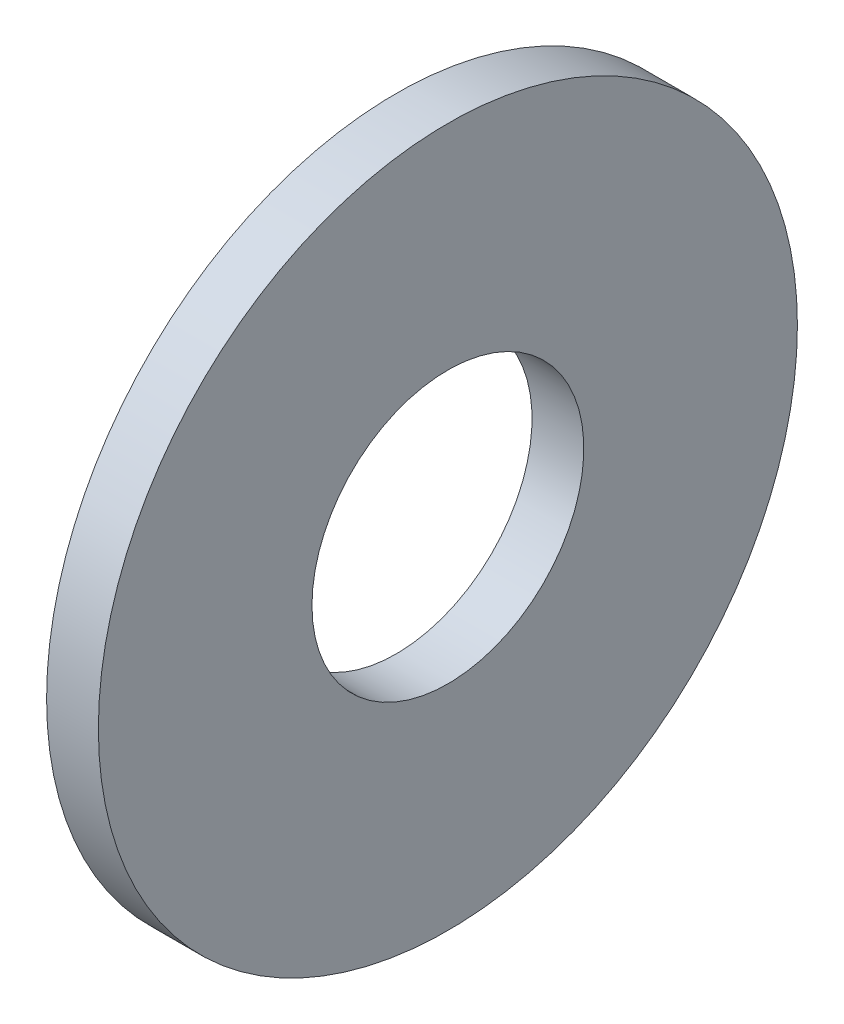
ISO-10303-21;
HEADER;
FILE_DESCRIPTION(('STEP AP214'),'2;1');
FILE_NAME('part.step','',(''),(''),'','','');
FILE_SCHEMA(('AUTOMOTIVE_DESIGN { 1 0 10303 214 1 1 1 1 }'));
ENDSEC;
DATA;
#1=APPLICATION_CONTEXT('core data for automotive mechanical design processes');
#2=APPLICATION_PROTOCOL_DEFINITION('international standard','automotive_design',2000,#1);
#3=PRODUCT_CONTEXT('',#1,'mechanical');
#4=PRODUCT('Part','Part','',(#3));
#5=PRODUCT_RELATED_PRODUCT_CATEGORY('part','',(#4));
#6=PRODUCT_DEFINITION_FORMATION('','',#4);
#7=PRODUCT_DEFINITION_CONTEXT('part definition',#1,'design');
#8=PRODUCT_DEFINITION('design','',#6,#7);
#9=PRODUCT_DEFINITION_SHAPE('','',#8);
#10=(LENGTH_UNIT() NAMED_UNIT(*) SI_UNIT(.MILLI.,.METRE.));
#11=(NAMED_UNIT(*) PLANE_ANGLE_UNIT() SI_UNIT($,.RADIAN.));
#12=(NAMED_UNIT(*) SI_UNIT($,.STERADIAN.) SOLID_ANGLE_UNIT());
#13=UNCERTAINTY_MEASURE_WITH_UNIT(LENGTH_MEASURE(1.E-05),#10,'distance_accuracy_value','');
#14=(GEOMETRIC_REPRESENTATION_CONTEXT(3) GLOBAL_UNCERTAINTY_ASSIGNED_CONTEXT((#13)) GLOBAL_UNIT_ASSIGNED_CONTEXT((#10,
#11,#12)) REPRESENTATION_CONTEXT('',''));
#15=CARTESIAN_POINT('',(0.,0.,0.));
#16=DIRECTION('',(0.,0.,1.));
#17=DIRECTION('',(1.,0.,0.));
#18=AXIS2_PLACEMENT_3D('',#15,#16,#17);
#19=CARTESIAN_POINT('',(0.,0.,-13.5));
#20=DIRECTION('',(1.,0.,0.));
#21=DIRECTION('',(0.,0.,-1.));
#22=AXIS2_PLACEMENT_3D('',#19,#20,#21);
#23=PLANE('',#22);
#24=CARTESIAN_POINT('',(0.,0.,0.));
#25=DIRECTION('',(-1.,0.,0.));
#26=DIRECTION('',(0.,0.,1.));
#27=AXIS2_PLACEMENT_3D('',#24,#25,#26);
#28=CIRCLE('',#27,5.25);
#29=CARTESIAN_POINT('',(0.,0.,5.25));
#30=VERTEX_POINT('',#29);
#31=EDGE_CURVE('E10',#30,#30,#28,.T.);
#32=ORIENTED_EDGE('',*,*,#31,.F.);
#33=EDGE_LOOP('',(#32));
#34=FACE_BOUND('',#33,.T.);
#35=CARTESIAN_POINT('',(0.,0.,0.));
#36=DIRECTION('',(-1.,0.,0.));
#37=DIRECTION('',(0.,0.,1.));
#38=AXIS2_PLACEMENT_3D('',#35,#36,#37);
#39=CIRCLE('',#38,13.5);
#40=CARTESIAN_POINT('',(0.,0.,13.5));
#41=VERTEX_POINT('',#40);
#42=EDGE_CURVE('E50',#41,#41,#39,.T.);
#43=ORIENTED_EDGE('',*,*,#42,.T.);
#44=EDGE_LOOP('',(#43));
#45=FACE_BOUND('',#44,.T.);
#46=ADVANCED_FACE('F31',(#34,#45),#23,.F.);
#47=CARTESIAN_POINT('',(0.,0.,0.));
#48=DIRECTION('',(-1.,0.,0.));
#49=DIRECTION('',(0.,0.,1.));
#50=AXIS2_PLACEMENT_3D('',#47,#48,#49);
#51=CYLINDRICAL_SURFACE('',#50,5.25);
#52=CARTESIAN_POINT('',(2.,0.,0.));
#53=DIRECTION('',(-1.,0.,0.));
#54=DIRECTION('',(0.,0.,1.));
#55=AXIS2_PLACEMENT_3D('',#52,#53,#54);
#56=CIRCLE('',#55,5.25);
#57=CARTESIAN_POINT('',(2.,0.,5.25));
#58=VERTEX_POINT('',#57);
#59=EDGE_CURVE('E39',#58,#58,#56,.T.);
#60=ORIENTED_EDGE('',*,*,#59,.F.);
#61=EDGE_LOOP('',(#60));
#62=FACE_BOUND('',#61,.T.);
#63=ORIENTED_EDGE('',*,*,#31,.T.);
#64=EDGE_LOOP('',(#63));
#65=FACE_BOUND('',#64,.T.);
#66=ADVANCED_FACE('F64',(#62,#65),#51,.F.);
#67=CARTESIAN_POINT('',(2.,0.,-13.5));
#68=DIRECTION('',(-1.,0.,0.));
#69=DIRECTION('',(0.,0.,1.));
#70=AXIS2_PLACEMENT_3D('',#67,#68,#69);
#71=PLANE('',#70);
#72=CARTESIAN_POINT('',(2.,0.,0.));
#73=DIRECTION('',(-1.,0.,0.));
#74=DIRECTION('',(0.,0.,1.));
#75=AXIS2_PLACEMENT_3D('',#72,#73,#74);
#76=CIRCLE('',#75,13.5);
#77=CARTESIAN_POINT('',(2.,0.,13.5));
#78=VERTEX_POINT('',#77);
#79=EDGE_CURVE('E43',#78,#78,#76,.T.);
#80=ORIENTED_EDGE('',*,*,#79,.F.);
#81=EDGE_LOOP('',(#80));
#82=FACE_BOUND('',#81,.T.);
#83=ORIENTED_EDGE('',*,*,#59,.T.);
#84=EDGE_LOOP('',(#83));
#85=FACE_BOUND('',#84,.T.);
#86=ADVANCED_FACE('F60',(#82,#85),#71,.F.);
#87=CARTESIAN_POINT('',(0.,0.,0.));
#88=DIRECTION('',(-1.,0.,0.));
#89=DIRECTION('',(0.,0.,1.));
#90=AXIS2_PLACEMENT_3D('',#87,#88,#89);
#91=CYLINDRICAL_SURFACE('',#90,13.5);
#92=ORIENTED_EDGE('',*,*,#42,.F.);
#93=EDGE_LOOP('',(#92));
#94=FACE_BOUND('',#93,.T.);
#95=ORIENTED_EDGE('',*,*,#79,.T.);
#96=EDGE_LOOP('',(#95));
#97=FACE_BOUND('',#96,.T.);
#98=ADVANCED_FACE('F53',(#94,#97),#91,.T.);
#99=CLOSED_SHELL('',(#46,#66,#86,#98));
#100=MANIFOLD_SOLID_BREP('B2',#99);
#101=ADVANCED_BREP_SHAPE_REPRESENTATION('',(#18,#100),#14);
#102=SHAPE_DEFINITION_REPRESENTATION(#9,#101);
ENDSEC;
END-ISO-10303-21;
